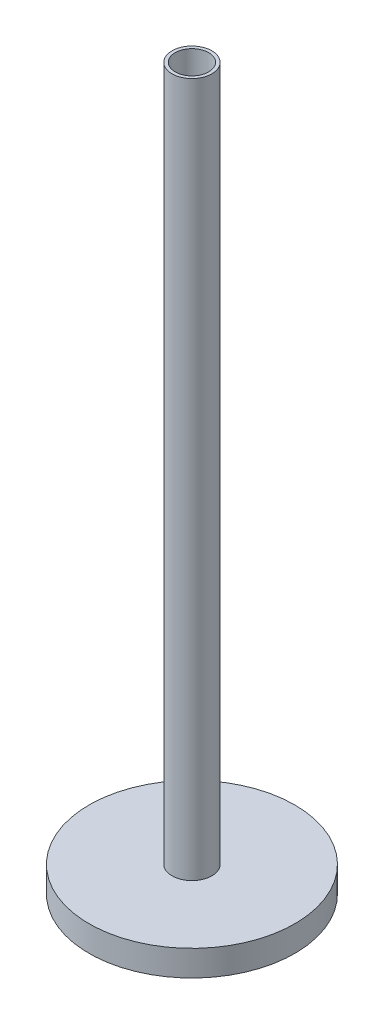
ISO-10303-21;
HEADER;
FILE_DESCRIPTION(('STEP AP214'),'2;1');
FILE_NAME('part.step','',(''),(''),'','','');
FILE_SCHEMA(('AUTOMOTIVE_DESIGN { 1 0 10303 214 1 1 1 1 }'));
ENDSEC;
DATA;
#1=APPLICATION_CONTEXT('core data for automotive mechanical design processes');
#2=APPLICATION_PROTOCOL_DEFINITION('international standard','automotive_design',2000,#1);
#3=PRODUCT_CONTEXT('',#1,'mechanical');
#4=PRODUCT('Part','Part','',(#3));
#5=PRODUCT_RELATED_PRODUCT_CATEGORY('part','',(#4));
#6=PRODUCT_DEFINITION_FORMATION('','',#4);
#7=PRODUCT_DEFINITION_CONTEXT('part definition',#1,'design');
#8=PRODUCT_DEFINITION('design','',#6,#7);
#9=PRODUCT_DEFINITION_SHAPE('','',#8);
#10=(LENGTH_UNIT() NAMED_UNIT(*) SI_UNIT(.MILLI.,.METRE.));
#11=(NAMED_UNIT(*) PLANE_ANGLE_UNIT() SI_UNIT($,.RADIAN.));
#12=(NAMED_UNIT(*) SI_UNIT($,.STERADIAN.) SOLID_ANGLE_UNIT());
#13=UNCERTAINTY_MEASURE_WITH_UNIT(LENGTH_MEASURE(1.E-05),#10,'distance_accuracy_value','');
#14=(GEOMETRIC_REPRESENTATION_CONTEXT(3) GLOBAL_UNCERTAINTY_ASSIGNED_CONTEXT((#13)) GLOBAL_UNIT_ASSIGNED_CONTEXT((#10,
#11,#12)) REPRESENTATION_CONTEXT('',''));
#15=CARTESIAN_POINT('',(0.,0.,0.));
#16=DIRECTION('',(0.,0.,1.));
#17=DIRECTION('',(1.,0.,0.));
#18=AXIS2_PLACEMENT_3D('',#15,#16,#17);
#19=CARTESIAN_POINT('',(0.,-10.,0.));
#20=DIRECTION('',(0.,-1.,0.));
#21=DIRECTION('',(0.,0.,-1.));
#22=AXIS2_PLACEMENT_3D('',#19,#20,#21);
#23=PLANE('',#22);
#24=CARTESIAN_POINT('',(0.,-10.,0.));
#25=DIRECTION('',(0.,-1.,0.));
#26=DIRECTION('',(0.,0.,-1.));
#27=AXIS2_PLACEMENT_3D('',#24,#25,#26);
#28=CIRCLE('',#27,40.0005182234462);
#29=CARTESIAN_POINT('',(0.,-10.,-40.0005182234462));
#30=VERTEX_POINT('',#29);
#31=EDGE_CURVE('E11',#30,#30,#28,.T.);
#32=ORIENTED_EDGE('',*,*,#31,.T.);
#33=EDGE_LOOP('',(#32));
#34=FACE_BOUND('',#33,.T.);
#35=CARTESIAN_POINT('',(0.,-10.,0.));
#36=DIRECTION('',(0.,-1.,0.));
#37=DIRECTION('',(0.,0.,-1.));
#38=AXIS2_PLACEMENT_3D('',#35,#36,#37);
#39=CIRCLE('',#38,7.75);
#40=CARTESIAN_POINT('',(0.,-10.,-7.75));
#41=VERTEX_POINT('',#40);
#42=EDGE_CURVE('E50',#41,#41,#39,.T.);
#43=ORIENTED_EDGE('',*,*,#42,.F.);
#44=EDGE_LOOP('',(#43));
#45=FACE_BOUND('',#44,.T.);
#46=ADVANCED_FACE('F39',(#34,#45),#23,.T.);
#47=CARTESIAN_POINT('',(0.,0.,0.));
#48=DIRECTION('',(0.,-1.,0.));
#49=DIRECTION('',(0.,0.,-1.));
#50=AXIS2_PLACEMENT_3D('',#47,#48,#49);
#51=PLANE('',#50);
#52=CARTESIAN_POINT('',(0.,0.,0.));
#53=DIRECTION('',(0.,-1.,0.));
#54=DIRECTION('',(0.,0.,-1.));
#55=AXIS2_PLACEMENT_3D('',#52,#53,#54);
#56=CIRCLE('',#55,40.0005182234462);
#57=CARTESIAN_POINT('',(0.,0.,-40.0005182234462));
#58=VERTEX_POINT('',#57);
#59=EDGE_CURVE('E43',#58,#58,#56,.T.);
#60=ORIENTED_EDGE('',*,*,#59,.F.);
#61=EDGE_LOOP('',(#60));
#62=FACE_BOUND('',#61,.T.);
#63=CARTESIAN_POINT('',(0.,0.,0.));
#64=DIRECTION('',(0.,-1.,0.));
#65=DIRECTION('',(0.,0.,-1.));
#66=AXIS2_PLACEMENT_3D('',#63,#64,#65);
#67=CIRCLE('',#66,7.75);
#68=CARTESIAN_POINT('',(0.,0.,-7.75));
#69=VERTEX_POINT('',#68);
#70=EDGE_CURVE('E52',#69,#69,#67,.T.);
#71=ORIENTED_EDGE('',*,*,#70,.T.);
#72=EDGE_LOOP('',(#71));
#73=FACE_BOUND('',#72,.T.);
#74=ADVANCED_FACE('F62',(#62,#73),#51,.F.);
#75=CARTESIAN_POINT('',(0.,-10.,0.));
#76=DIRECTION('',(0.,1.,0.));
#77=DIRECTION('',(0.,0.,1.));
#78=AXIS2_PLACEMENT_3D('',#75,#76,#77);
#79=CYLINDRICAL_SURFACE('',#78,40.0005182234462);
#80=ORIENTED_EDGE('',*,*,#31,.F.);
#81=EDGE_LOOP('',(#80));
#82=FACE_BOUND('',#81,.T.);
#83=ORIENTED_EDGE('',*,*,#59,.T.);
#84=EDGE_LOOP('',(#83));
#85=FACE_BOUND('',#84,.T.);
#86=ADVANCED_FACE('F41',(#82,#85),#79,.T.);
#87=CARTESIAN_POINT('',(0.,-10.,0.));
#88=DIRECTION('',(0.,1.,0.));
#89=DIRECTION('',(0.,0.,1.));
#90=AXIS2_PLACEMENT_3D('',#87,#88,#89);
#91=CYLINDRICAL_SURFACE('',#90,7.75);
#92=ORIENTED_EDGE('',*,*,#42,.T.);
#93=EDGE_LOOP('',(#92));
#94=FACE_BOUND('',#93,.T.);
#95=ORIENTED_EDGE('',*,*,#70,.F.);
#96=EDGE_LOOP('',(#95));
#97=FACE_BOUND('',#96,.T.);
#98=ADVANCED_FACE('F58',(#94,#97),#91,.F.);
#99=CLOSED_SHELL('',(#46,#74,#86,#98));
#100=MANIFOLD_SOLID_BREP('B2',#99);
#101=CARTESIAN_POINT('',(0.,270.,0.));
#102=DIRECTION('',(0.,1.,0.));
#103=DIRECTION('',(0.,0.,1.));
#104=AXIS2_PLACEMENT_3D('',#101,#102,#103);
#105=PLANE('',#104);
#106=CARTESIAN_POINT('',(0.,270.,0.));
#107=DIRECTION('',(0.,1.,0.));
#108=DIRECTION('',(0.,0.,1.));
#109=AXIS2_PLACEMENT_3D('',#106,#107,#108);
#110=CIRCLE('',#109,7.75);
#111=CARTESIAN_POINT('',(0.,270.,7.75));
#112=VERTEX_POINT('',#111);
#113=EDGE_CURVE('E38',#112,#112,#110,.T.);
#114=ORIENTED_EDGE('',*,*,#113,.T.);
#115=EDGE_LOOP('',(#114));
#116=FACE_BOUND('',#115,.T.);
#117=CARTESIAN_POINT('',(0.,270.,0.));
#118=DIRECTION('',(0.,1.,0.));
#119=DIRECTION('',(0.,0.,1.));
#120=AXIS2_PLACEMENT_3D('',#117,#118,#119);
#121=CIRCLE('',#120,6.5);
#122=CARTESIAN_POINT('',(0.,270.,6.5));
#123=VERTEX_POINT('',#122);
#124=EDGE_CURVE('E108',#123,#123,#121,.T.);
#125=ORIENTED_EDGE('',*,*,#124,.F.);
#126=EDGE_LOOP('',(#125));
#127=FACE_BOUND('',#126,.T.);
#128=ADVANCED_FACE('F101',(#116,#127),#105,.T.);
#129=CARTESIAN_POINT('',(0.,270.,0.));
#130=DIRECTION('',(0.,-1.,0.));
#131=DIRECTION('',(0.,0.,-1.));
#132=AXIS2_PLACEMENT_3D('',#129,#130,#131);
#133=CYLINDRICAL_SURFACE('',#132,7.75);
#134=ORIENTED_EDGE('',*,*,#113,.F.);
#135=EDGE_LOOP('',(#134));
#136=FACE_BOUND('',#135,.T.);
#137=CARTESIAN_POINT('',(0.,-20.4764296628904,0.));
#138=DIRECTION('',(0.,1.,0.));
#139=DIRECTION('',(0.,0.,1.));
#140=AXIS2_PLACEMENT_3D('',#137,#138,#139);
#141=CIRCLE('',#140,7.75);
#142=CARTESIAN_POINT('',(0.,-20.4764296628904,7.75));
#143=VERTEX_POINT('',#142);
#144=EDGE_CURVE('E112',#143,#143,#141,.T.);
#145=ORIENTED_EDGE('',*,*,#144,.T.);
#146=EDGE_LOOP('',(#145));
#147=FACE_BOUND('',#146,.T.);
#148=ADVANCED_FACE('F103',(#136,#147),#133,.T.);
#149=CARTESIAN_POINT('',(0.,270.,0.));
#150=DIRECTION('',(0.,-1.,0.));
#151=DIRECTION('',(0.,0.,-1.));
#152=AXIS2_PLACEMENT_3D('',#149,#150,#151);
#153=CYLINDRICAL_SURFACE('',#152,6.5);
#154=ORIENTED_EDGE('',*,*,#124,.T.);
#155=EDGE_LOOP('',(#154));
#156=FACE_BOUND('',#155,.T.);
#157=CARTESIAN_POINT('',(0.,-20.4764296628904,0.));
#158=DIRECTION('',(0.,1.,0.));
#159=DIRECTION('',(0.,0.,1.));
#160=AXIS2_PLACEMENT_3D('',#157,#158,#159);
#161=CIRCLE('',#160,6.5);
#162=CARTESIAN_POINT('',(0.,-20.4764296628904,6.5));
#163=VERTEX_POINT('',#162);
#164=EDGE_CURVE('E116',#163,#163,#161,.T.);
#165=ORIENTED_EDGE('',*,*,#164,.F.);
#166=EDGE_LOOP('',(#165));
#167=FACE_BOUND('',#166,.T.);
#168=ADVANCED_FACE('F125',(#156,#167),#153,.F.);
#169=CARTESIAN_POINT('',(0.,-20.4764296628904,0.));
#170=DIRECTION('',(0.,1.,0.));
#171=DIRECTION('',(0.,0.,1.));
#172=AXIS2_PLACEMENT_3D('',#169,#170,#171);
#173=PLANE('',#172);
#174=ORIENTED_EDGE('',*,*,#164,.T.);
#175=EDGE_LOOP('',(#174));
#176=FACE_BOUND('',#175,.T.);
#177=ORIENTED_EDGE('',*,*,#144,.F.);
#178=EDGE_LOOP('',(#177));
#179=FACE_BOUND('',#178,.T.);
#180=ADVANCED_FACE('F122',(#176,#179),#173,.F.);
#181=CLOSED_SHELL('',(#128,#148,#168,#180));
#182=MANIFOLD_SOLID_BREP('B6',#181);
#183=ADVANCED_BREP_SHAPE_REPRESENTATION('',(#18,#100,#182),#14);
#184=SHAPE_DEFINITION_REPRESENTATION(#9,#183);
ENDSEC;
END-ISO-10303-21;
